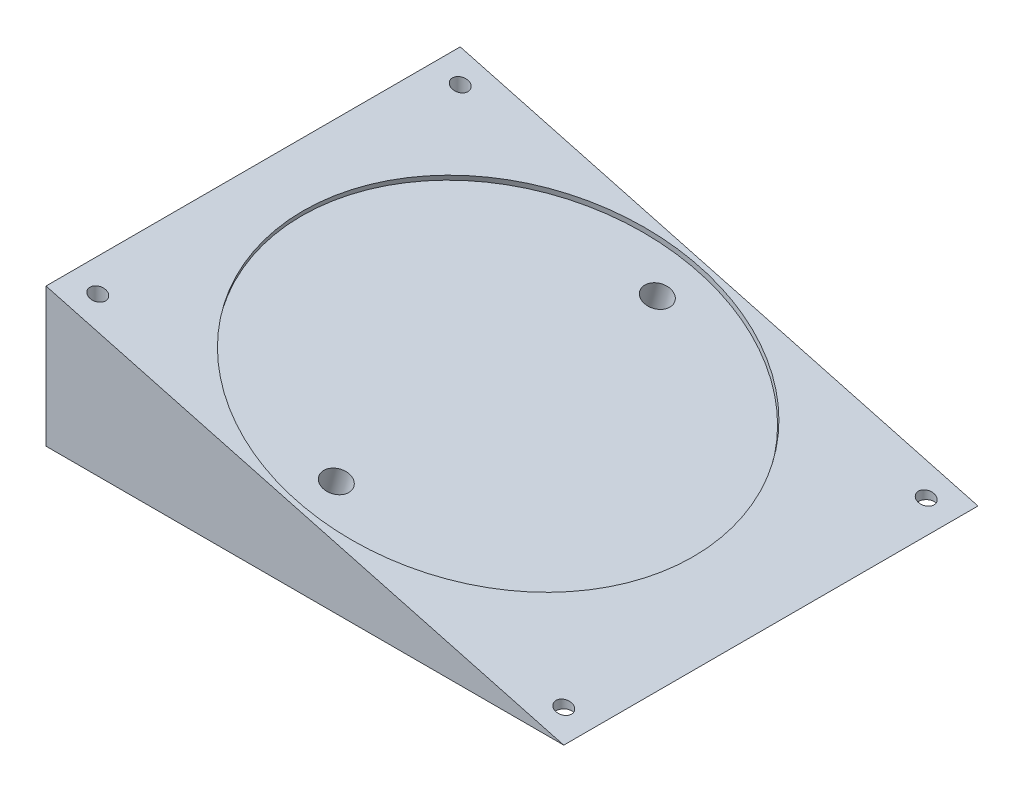
ISO-10303-21;
HEADER;
FILE_DESCRIPTION(('STEP AP214'),'2;1');
FILE_NAME('part.step','',(''),(''),'','','');
FILE_SCHEMA(('AUTOMOTIVE_DESIGN { 1 0 10303 214 1 1 1 1 }'));
ENDSEC;
DATA;
#1=APPLICATION_CONTEXT('core data for automotive mechanical design processes');
#2=APPLICATION_PROTOCOL_DEFINITION('international standard','automotive_design',2000,#1);
#3=PRODUCT_CONTEXT('',#1,'mechanical');
#4=PRODUCT('Part','Part','',(#3));
#5=PRODUCT_RELATED_PRODUCT_CATEGORY('part','',(#4));
#6=PRODUCT_DEFINITION_FORMATION('','',#4);
#7=PRODUCT_DEFINITION_CONTEXT('part definition',#1,'design');
#8=PRODUCT_DEFINITION('design','',#6,#7);
#9=PRODUCT_DEFINITION_SHAPE('','',#8);
#10=(LENGTH_UNIT() NAMED_UNIT(*) SI_UNIT(.MILLI.,.METRE.));
#11=(NAMED_UNIT(*) PLANE_ANGLE_UNIT() SI_UNIT($,.RADIAN.));
#12=(NAMED_UNIT(*) SI_UNIT($,.STERADIAN.) SOLID_ANGLE_UNIT());
#13=UNCERTAINTY_MEASURE_WITH_UNIT(LENGTH_MEASURE(1.E-05),#10,'distance_accuracy_value','');
#14=(GEOMETRIC_REPRESENTATION_CONTEXT(3) GLOBAL_UNCERTAINTY_ASSIGNED_CONTEXT((#13)) GLOBAL_UNIT_ASSIGNED_CONTEXT((#10,
#11,#12)) REPRESENTATION_CONTEXT('',''));
#15=CARTESIAN_POINT('',(0.,0.,0.));
#16=DIRECTION('',(0.,0.,1.));
#17=DIRECTION('',(1.,0.,0.));
#18=AXIS2_PLACEMENT_3D('',#15,#16,#17);
#19=CARTESIAN_POINT('',(50.,0.,80.));
#20=DIRECTION('',(-0.258819045102514,-0.96592582628907,0.));
#21=DIRECTION('',(0.96592582628907,-0.258819045102514,0.));
#22=AXIS2_PLACEMENT_3D('',#19,#20,#21);
#23=PLANE('',#22);
#24=CARTESIAN_POINT('',(45.,1.33974596215558,5.));
#25=DIRECTION('',(-0.258819045102514,-0.96592582628907,0.));
#26=DIRECTION('',(0.96592582628907,-0.258819045102514,0.));
#27=AXIS2_PLACEMENT_3D('',#24,#25,#26);
#28=ELLIPSE('',#27,1.55291427061513,1.5);
#29=CARTESIAN_POINT('',(46.5,0.937822173508906,5.));
#30=VERTEX_POINT('',#29);
#31=EDGE_CURVE('E117',#30,#30,#28,.T.);
#32=ORIENTED_EDGE('',*,*,#31,.T.);
#33=EDGE_LOOP('',(#32));
#34=FACE_BOUND('',#33,.T.);
#35=CARTESIAN_POINT('',(-45.,25.455173280956,75.));
#36=DIRECTION('',(-0.258819045102514,-0.96592582628907,0.));
#37=DIRECTION('',(0.96592582628907,-0.258819045102514,0.));
#38=AXIS2_PLACEMENT_3D('',#35,#36,#37);
#39=ELLIPSE('',#38,1.55291427061513,1.5);
#40=CARTESIAN_POINT('',(-43.5,25.0532494923093,75.));
#41=VERTEX_POINT('',#40);
#42=EDGE_CURVE('E121',#41,#41,#39,.T.);
#43=ORIENTED_EDGE('',*,*,#42,.T.);
#44=EDGE_LOOP('',(#43));
#45=FACE_BOUND('',#44,.T.);
#46=CARTESIAN_POINT('',(-2.66963451183558,14.1127860330884,40.));
#47=DIRECTION('',(0.258819045102514,0.96592582628907,0.));
#48=DIRECTION('',(-0.96592582628907,0.258819045102514,0.));
#49=AXIS2_PLACEMENT_3D('',#46,#47,#48);
#50=CIRCLE('',#49,39.);
#51=CARTESIAN_POINT('',(-40.3407417371093,24.2067287920864,40.));
#52=VERTEX_POINT('',#51);
#53=EDGE_CURVE('E88',#52,#52,#50,.T.);
#54=ORIENTED_EDGE('',*,*,#53,.F.);
#55=EDGE_LOOP('',(#54));
#56=FACE_BOUND('',#55,.T.);
#57=DIRECTION('',(-0.96592582628907,0.258819045102514,0.));
#58=VECTOR('',#57,1.);
#59=CARTESIAN_POINT('',(50.,0.,0.));
#60=LINE('',#59,#58);
#61=CARTESIAN_POINT('',(50.,0.,0.));
#62=VERTEX_POINT('',#61);
#63=CARTESIAN_POINT('',(-50.,26.7949192431116,0.));
#64=VERTEX_POINT('',#63);
#65=EDGE_CURVE('E81',#62,#64,#60,.T.);
#66=ORIENTED_EDGE('',*,*,#65,.T.);
#67=DIRECTION('',(0.,0.,-1.));
#68=VECTOR('',#67,1.);
#69=CARTESIAN_POINT('',(-50.,26.7949192431116,80.));
#70=LINE('',#69,#68);
#71=CARTESIAN_POINT('',(-50.,26.7949192431116,80.));
#72=VERTEX_POINT('',#71);
#73=EDGE_CURVE('E11',#72,#64,#70,.T.);
#74=ORIENTED_EDGE('',*,*,#73,.F.);
#75=DIRECTION('',(-0.96592582628907,0.258819045102514,0.));
#76=VECTOR('',#75,1.);
#77=CARTESIAN_POINT('',(50.,0.,80.));
#78=LINE('',#77,#76);
#79=CARTESIAN_POINT('',(50.,0.,80.));
#80=VERTEX_POINT('',#79);
#81=EDGE_CURVE('E73',#80,#72,#78,.T.);
#82=ORIENTED_EDGE('',*,*,#81,.F.);
#83=DIRECTION('',(0.,0.,-1.));
#84=VECTOR('',#83,1.);
#85=CARTESIAN_POINT('',(50.,0.,80.));
#86=LINE('',#85,#84);
#87=EDGE_CURVE('E82',#80,#62,#86,.T.);
#88=ORIENTED_EDGE('',*,*,#87,.T.);
#89=EDGE_LOOP('',(#66,#74,#82,#88));
#90=FACE_BOUND('',#89,.T.);
#91=CARTESIAN_POINT('',(45.,1.33974596215558,75.));
#92=DIRECTION('',(-0.258819045102514,-0.96592582628907,0.));
#93=DIRECTION('',(0.96592582628907,-0.258819045102514,0.));
#94=AXIS2_PLACEMENT_3D('',#91,#92,#93);
#95=ELLIPSE('',#94,1.55291427061513,1.5);
#96=CARTESIAN_POINT('',(46.5,0.937822173508906,75.));
#97=VERTEX_POINT('',#96);
#98=EDGE_CURVE('E143',#97,#97,#95,.F.);
#99=ORIENTED_EDGE('',*,*,#98,.F.);
#100=EDGE_LOOP('',(#99));
#101=FACE_BOUND('',#100,.T.);
#102=CARTESIAN_POINT('',(-45.,25.455173280956,5.));
#103=DIRECTION('',(-0.258819045102514,-0.96592582628907,0.));
#104=DIRECTION('',(0.96592582628907,-0.258819045102514,0.));
#105=AXIS2_PLACEMENT_3D('',#102,#103,#104);
#106=ELLIPSE('',#105,1.55291427061513,1.5);
#107=CARTESIAN_POINT('',(-43.5,25.0532494923093,5.));
#108=VERTEX_POINT('',#107);
#109=EDGE_CURVE('E135',#108,#108,#106,.F.);
#110=ORIENTED_EDGE('',*,*,#109,.F.);
#111=EDGE_LOOP('',(#110));
#112=FACE_BOUND('',#111,.T.);
#113=ADVANCED_FACE('F33',(#34,#45,#56,#90,#101,#112),#23,.F.);
#114=CARTESIAN_POINT('',(-50.,0.,80.));
#115=DIRECTION('',(0.,1.,0.));
#116=DIRECTION('',(0.,0.,1.));
#117=AXIS2_PLACEMENT_3D('',#114,#115,#116);
#118=PLANE('',#117);
#119=CARTESIAN_POINT('',(45.,0.,5.));
#120=DIRECTION('',(0.,-1.,0.));
#121=DIRECTION('',(0.,0.,-1.));
#122=AXIS2_PLACEMENT_3D('',#119,#120,#121);
#123=CIRCLE('',#122,1.5);
#124=CARTESIAN_POINT('',(45.,0.,3.49999999999999));
#125=VERTEX_POINT('',#124);
#126=EDGE_CURVE('E154',#125,#125,#123,.T.);
#127=ORIENTED_EDGE('',*,*,#126,.F.);
#128=EDGE_LOOP('',(#127));
#129=FACE_BOUND('',#128,.T.);
#130=CARTESIAN_POINT('',(-45.,0.,75.));
#131=DIRECTION('',(0.,-1.,0.));
#132=DIRECTION('',(0.,0.,-1.));
#133=AXIS2_PLACEMENT_3D('',#130,#131,#132);
#134=CIRCLE('',#133,1.5);
#135=CARTESIAN_POINT('',(-45.,0.,73.5));
#136=VERTEX_POINT('',#135);
#137=EDGE_CURVE('E147',#136,#136,#134,.T.);
#138=ORIENTED_EDGE('',*,*,#137,.F.);
#139=EDGE_LOOP('',(#138));
#140=FACE_BOUND('',#139,.T.);
#141=DIRECTION('',(1.,0.,0.));
#142=VECTOR('',#141,1.);
#143=CARTESIAN_POINT('',(-50.,0.,0.));
#144=LINE('',#143,#142);
#145=CARTESIAN_POINT('',(-50.,0.,0.));
#146=VERTEX_POINT('',#145);
#147=EDGE_CURVE('E66',#146,#62,#144,.T.);
#148=ORIENTED_EDGE('',*,*,#147,.T.);
#149=ORIENTED_EDGE('',*,*,#87,.F.);
#150=DIRECTION('',(1.,0.,0.));
#151=VECTOR('',#150,1.);
#152=CARTESIAN_POINT('',(-50.,0.,80.));
#153=LINE('',#152,#151);
#154=CARTESIAN_POINT('',(-50.,0.,80.));
#155=VERTEX_POINT('',#154);
#156=EDGE_CURVE('E49',#155,#80,#153,.T.);
#157=ORIENTED_EDGE('',*,*,#156,.F.);
#158=DIRECTION('',(0.,0.,-1.));
#159=VECTOR('',#158,1.);
#160=CARTESIAN_POINT('',(-50.,0.,80.));
#161=LINE('',#160,#159);
#162=EDGE_CURVE('E41',#155,#146,#161,.T.);
#163=ORIENTED_EDGE('',*,*,#162,.T.);
#164=EDGE_LOOP('',(#148,#149,#157,#163));
#165=FACE_BOUND('',#164,.T.);
#166=CARTESIAN_POINT('',(45.,0.,75.));
#167=DIRECTION('',(0.,1.,0.));
#168=DIRECTION('',(0.,0.,1.));
#169=AXIS2_PLACEMENT_3D('',#166,#167,#168);
#170=CIRCLE('',#169,1.5);
#171=CARTESIAN_POINT('',(45.,0.,76.5));
#172=VERTEX_POINT('',#171);
#173=EDGE_CURVE('E150',#172,#172,#170,.T.);
#174=ORIENTED_EDGE('',*,*,#173,.T.);
#175=EDGE_LOOP('',(#174));
#176=FACE_BOUND('',#175,.T.);
#177=CARTESIAN_POINT('',(-45.,0.,5.));
#178=DIRECTION('',(0.,1.,0.));
#179=DIRECTION('',(0.,0.,1.));
#180=AXIS2_PLACEMENT_3D('',#177,#178,#179);
#181=CIRCLE('',#180,1.5);
#182=CARTESIAN_POINT('',(-45.,0.,6.5));
#183=VERTEX_POINT('',#182);
#184=EDGE_CURVE('E151',#183,#183,#181,.T.);
#185=ORIENTED_EDGE('',*,*,#184,.T.);
#186=EDGE_LOOP('',(#185));
#187=FACE_BOUND('',#186,.T.);
#188=ADVANCED_FACE('F93',(#129,#140,#165,#176,#187),#118,.F.);
#189=CARTESIAN_POINT('',(-50.,26.7949192431116,80.));
#190=DIRECTION('',(1.,0.,0.));
#191=DIRECTION('',(0.,0.,-1.));
#192=AXIS2_PLACEMENT_3D('',#189,#190,#191);
#193=PLANE('',#192);
#194=DIRECTION('',(0.,-1.,0.));
#195=VECTOR('',#194,1.);
#196=CARTESIAN_POINT('',(-50.,26.7949192431116,0.));
#197=LINE('',#196,#195);
#198=EDGE_CURVE('E61',#64,#146,#197,.T.);
#199=ORIENTED_EDGE('',*,*,#198,.T.);
#200=ORIENTED_EDGE('',*,*,#162,.F.);
#201=DIRECTION('',(0.,-1.,0.));
#202=VECTOR('',#201,1.);
#203=CARTESIAN_POINT('',(-50.,26.7949192431116,80.));
#204=LINE('',#203,#202);
#205=EDGE_CURVE('E69',#72,#155,#204,.T.);
#206=ORIENTED_EDGE('',*,*,#205,.F.);
#207=ORIENTED_EDGE('',*,*,#73,.T.);
#208=EDGE_LOOP('',(#199,#200,#206,#207));
#209=FACE_BOUND('',#208,.T.);
#210=ADVANCED_FACE('F70',(#209),#193,.F.);
#211=CARTESIAN_POINT('',(0.,0.,80.));
#212=DIRECTION('',(0.,0.,1.));
#213=DIRECTION('',(1.,0.,0.));
#214=AXIS2_PLACEMENT_3D('',#211,#212,#213);
#215=PLANE('',#214);
#216=ORIENTED_EDGE('',*,*,#81,.T.);
#217=ORIENTED_EDGE('',*,*,#205,.T.);
#218=ORIENTED_EDGE('',*,*,#156,.T.);
#219=EDGE_LOOP('',(#216,#217,#218));
#220=FACE_BOUND('',#219,.T.);
#221=ADVANCED_FACE('F76',(#220),#215,.T.);
#222=CARTESIAN_POINT('',(0.,0.,0.));
#223=DIRECTION('',(0.,0.,1.));
#224=DIRECTION('',(1.,0.,0.));
#225=AXIS2_PLACEMENT_3D('',#222,#223,#224);
#226=PLANE('',#225);
#227=ORIENTED_EDGE('',*,*,#65,.F.);
#228=ORIENTED_EDGE('',*,*,#147,.F.);
#229=ORIENTED_EDGE('',*,*,#198,.F.);
#230=EDGE_LOOP('',(#227,#228,#229));
#231=FACE_BOUND('',#230,.T.);
#232=ADVANCED_FACE('F95',(#231),#226,.F.);
#233=CARTESIAN_POINT('',(-2.92845355693809,13.1468602067993,40.));
#234=DIRECTION('',(0.258819045102514,0.96592582628907,0.));
#235=DIRECTION('',(-0.96592582628907,0.258819045102514,0.));
#236=AXIS2_PLACEMENT_3D('',#233,#234,#235);
#237=CYLINDRICAL_SURFACE('',#236,39.);
#238=CARTESIAN_POINT('',(-2.92845355693809,13.1468602067993,40.));
#239=DIRECTION('',(0.258819045102514,0.96592582628907,0.));
#240=DIRECTION('',(-0.96592582628907,0.258819045102514,0.));
#241=AXIS2_PLACEMENT_3D('',#238,#239,#240);
#242=CIRCLE('',#241,39.);
#243=CARTESIAN_POINT('',(-40.5995607822118,23.2408029657973,40.));
#244=VERTEX_POINT('',#243);
#245=EDGE_CURVE('E84',#244,#244,#242,.T.);
#246=ORIENTED_EDGE('',*,*,#245,.F.);
#247=EDGE_LOOP('',(#246));
#248=FACE_BOUND('',#247,.T.);
#249=ORIENTED_EDGE('',*,*,#53,.T.);
#250=EDGE_LOOP('',(#249));
#251=FACE_BOUND('',#250,.T.);
#252=ADVANCED_FACE('F97',(#248,#251),#237,.F.);
#253=CARTESIAN_POINT('',(-2.92845355693809,13.1468602067993,40.));
#254=DIRECTION('',(0.258819045102514,0.96592582628907,0.));
#255=DIRECTION('',(-0.96592582628907,0.258819045102514,0.));
#256=AXIS2_PLACEMENT_3D('',#253,#254,#255);
#257=PLANE('',#256);
#258=CARTESIAN_POINT('',(-2.92845355693809,13.1468602067993,8.99999999999999));
#259=DIRECTION('',(0.258819045102514,0.96592582628907,0.));
#260=DIRECTION('',(-0.96592582628907,0.258819045102514,0.));
#261=AXIS2_PLACEMENT_3D('',#258,#259,#260);
#262=CIRCLE('',#261,2.5);
#263=CARTESIAN_POINT('',(-5.34326812266077,13.7939078195556,8.99999999999999));
#264=VERTEX_POINT('',#263);
#265=EDGE_CURVE('E128',#264,#264,#262,.T.);
#266=ORIENTED_EDGE('',*,*,#265,.F.);
#267=EDGE_LOOP('',(#266));
#268=FACE_BOUND('',#267,.T.);
#269=CARTESIAN_POINT('',(-2.92845355693809,13.1468602067993,71.));
#270=DIRECTION('',(0.258819045102514,0.96592582628907,0.));
#271=DIRECTION('',(-0.96592582628907,0.258819045102514,0.));
#272=AXIS2_PLACEMENT_3D('',#269,#270,#271);
#273=CIRCLE('',#272,2.5);
#274=CARTESIAN_POINT('',(-5.34326812266077,13.7939078195556,71.));
#275=VERTEX_POINT('',#274);
#276=EDGE_CURVE('E134',#275,#275,#273,.T.);
#277=ORIENTED_EDGE('',*,*,#276,.F.);
#278=EDGE_LOOP('',(#277));
#279=FACE_BOUND('',#278,.T.);
#280=ORIENTED_EDGE('',*,*,#245,.T.);
#281=EDGE_LOOP('',(#280));
#282=FACE_BOUND('',#281,.T.);
#283=ADVANCED_FACE('F103',(#268,#279,#282),#257,.T.);
#284=CARTESIAN_POINT('',(-4.48136782755317,7.35130524906486,71.));
#285=DIRECTION('',(0.258819045102514,0.96592582628907,0.));
#286=DIRECTION('',(-0.96592582628907,0.258819045102514,0.));
#287=AXIS2_PLACEMENT_3D('',#284,#285,#286);
#288=CYLINDRICAL_SURFACE('',#287,2.5);
#289=CARTESIAN_POINT('',(-4.48136782755317,7.35130524906486,71.));
#290=DIRECTION('',(0.258819045102514,0.96592582628907,0.));
#291=DIRECTION('',(-0.96592582628907,0.258819045102514,0.));
#292=AXIS2_PLACEMENT_3D('',#289,#290,#291);
#293=CIRCLE('',#292,2.5);
#294=CARTESIAN_POINT('',(-6.89618239327585,7.99835286182115,71.));
#295=VERTEX_POINT('',#294);
#296=EDGE_CURVE('E131',#295,#295,#293,.T.);
#297=ORIENTED_EDGE('',*,*,#296,.F.);
#298=EDGE_LOOP('',(#297));
#299=FACE_BOUND('',#298,.T.);
#300=ORIENTED_EDGE('',*,*,#276,.T.);
#301=EDGE_LOOP('',(#300));
#302=FACE_BOUND('',#301,.T.);
#303=ADVANCED_FACE('F194',(#299,#302),#288,.F.);
#304=CARTESIAN_POINT('',(-4.48136782755317,7.35130524906486,71.));
#305=DIRECTION('',(0.258819045102514,0.96592582628907,0.));
#306=DIRECTION('',(-0.96592582628907,0.258819045102514,0.));
#307=AXIS2_PLACEMENT_3D('',#304,#305,#306);
#308=PLANE('',#307);
#309=ORIENTED_EDGE('',*,*,#296,.T.);
#310=EDGE_LOOP('',(#309));
#311=FACE_BOUND('',#310,.T.);
#312=ADVANCED_FACE('F192',(#311),#308,.T.);
#313=CARTESIAN_POINT('',(-4.48136782755317,7.35130524906486,8.99999999999999));
#314=DIRECTION('',(0.258819045102514,0.96592582628907,0.));
#315=DIRECTION('',(-0.96592582628907,0.258819045102514,0.));
#316=AXIS2_PLACEMENT_3D('',#313,#314,#315);
#317=CYLINDRICAL_SURFACE('',#316,2.5);
#318=CARTESIAN_POINT('',(-4.48136782755317,7.35130524906486,8.99999999999999));
#319=DIRECTION('',(0.258819045102514,0.96592582628907,0.));
#320=DIRECTION('',(-0.96592582628907,0.258819045102514,0.));
#321=AXIS2_PLACEMENT_3D('',#318,#319,#320);
#322=CIRCLE('',#321,2.5);
#323=CARTESIAN_POINT('',(-6.89618239327585,7.99835286182115,8.99999999999999));
#324=VERTEX_POINT('',#323);
#325=EDGE_CURVE('E125',#324,#324,#322,.T.);
#326=ORIENTED_EDGE('',*,*,#325,.F.);
#327=EDGE_LOOP('',(#326));
#328=FACE_BOUND('',#327,.T.);
#329=ORIENTED_EDGE('',*,*,#265,.T.);
#330=EDGE_LOOP('',(#329));
#331=FACE_BOUND('',#330,.T.);
#332=ADVANCED_FACE('F188',(#328,#331),#317,.F.);
#333=CARTESIAN_POINT('',(-4.48136782755317,7.35130524906486,8.99999999999999));
#334=DIRECTION('',(0.258819045102514,0.96592582628907,0.));
#335=DIRECTION('',(-0.96592582628907,0.258819045102514,0.));
#336=AXIS2_PLACEMENT_3D('',#333,#334,#335);
#337=PLANE('',#336);
#338=ORIENTED_EDGE('',*,*,#325,.T.);
#339=EDGE_LOOP('',(#338));
#340=FACE_BOUND('',#339,.T.);
#341=ADVANCED_FACE('F184',(#340),#337,.T.);
#342=CARTESIAN_POINT('',(-45.,40.,75.));
#343=DIRECTION('',(0.,-1.,0.));
#344=DIRECTION('',(0.,0.,-1.));
#345=AXIS2_PLACEMENT_3D('',#342,#343,#344);
#346=CYLINDRICAL_SURFACE('',#345,1.5);
#347=ORIENTED_EDGE('',*,*,#137,.T.);
#348=EDGE_LOOP('',(#347));
#349=FACE_BOUND('',#348,.T.);
#350=ORIENTED_EDGE('',*,*,#42,.F.);
#351=EDGE_LOOP('',(#350));
#352=FACE_BOUND('',#351,.T.);
#353=ADVANCED_FACE('F165',(#349,#352),#346,.F.);
#354=CARTESIAN_POINT('',(45.,40.,75.));
#355=DIRECTION('',(0.,-1.,0.));
#356=DIRECTION('',(0.,0.,-1.));
#357=AXIS2_PLACEMENT_3D('',#354,#355,#356);
#358=CYLINDRICAL_SURFACE('',#357,1.5);
#359=ORIENTED_EDGE('',*,*,#173,.F.);
#360=EDGE_LOOP('',(#359));
#361=FACE_BOUND('',#360,.T.);
#362=ORIENTED_EDGE('',*,*,#98,.T.);
#363=EDGE_LOOP('',(#362));
#364=FACE_BOUND('',#363,.T.);
#365=ADVANCED_FACE('F161',(#361,#364),#358,.F.);
#366=CARTESIAN_POINT('',(45.,40.,5.));
#367=DIRECTION('',(0.,-1.,0.));
#368=DIRECTION('',(0.,0.,-1.));
#369=AXIS2_PLACEMENT_3D('',#366,#367,#368);
#370=CYLINDRICAL_SURFACE('',#369,1.5);
#371=ORIENTED_EDGE('',*,*,#126,.T.);
#372=EDGE_LOOP('',(#371));
#373=FACE_BOUND('',#372,.T.);
#374=ORIENTED_EDGE('',*,*,#31,.F.);
#375=EDGE_LOOP('',(#374));
#376=FACE_BOUND('',#375,.T.);
#377=ADVANCED_FACE('F164',(#373,#376),#370,.F.);
#378=CARTESIAN_POINT('',(-45.,40.,5.));
#379=DIRECTION('',(0.,-1.,0.));
#380=DIRECTION('',(0.,0.,-1.));
#381=AXIS2_PLACEMENT_3D('',#378,#379,#380);
#382=CYLINDRICAL_SURFACE('',#381,1.5);
#383=ORIENTED_EDGE('',*,*,#184,.F.);
#384=EDGE_LOOP('',(#383));
#385=FACE_BOUND('',#384,.T.);
#386=ORIENTED_EDGE('',*,*,#109,.T.);
#387=EDGE_LOOP('',(#386));
#388=FACE_BOUND('',#387,.T.);
#389=ADVANCED_FACE('F171',(#385,#388),#382,.F.);
#390=CLOSED_SHELL('',(#113,#188,#210,#221,#232,#252,#283,#303,#312,#332,#341,#353,#365,#377,#389));
#391=MANIFOLD_SOLID_BREP('B2',#390);
#392=ADVANCED_BREP_SHAPE_REPRESENTATION('',(#18,#391),#14);
#393=SHAPE_DEFINITION_REPRESENTATION(#9,#392);
ENDSEC;
END-ISO-10303-21;
